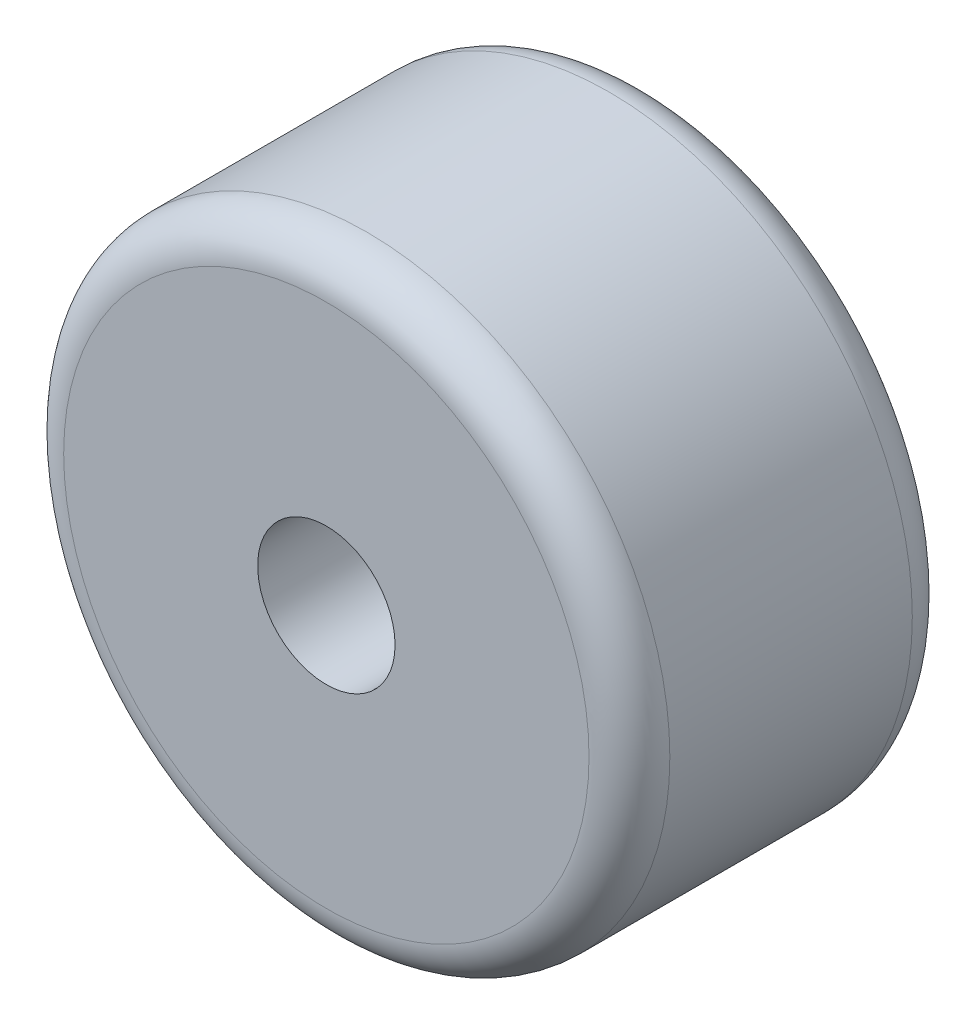
ISO-10303-21;
HEADER;
FILE_DESCRIPTION(('STEP AP214'),'2;1');
FILE_NAME('part.step','',(''),(''),'','','');
FILE_SCHEMA(('AUTOMOTIVE_DESIGN { 1 0 10303 214 1 1 1 1 }'));
ENDSEC;
DATA;
#1=APPLICATION_CONTEXT('core data for automotive mechanical design processes');
#2=APPLICATION_PROTOCOL_DEFINITION('international standard','automotive_design',2000,#1);
#3=PRODUCT_CONTEXT('',#1,'mechanical');
#4=PRODUCT('Part','Part','',(#3));
#5=PRODUCT_RELATED_PRODUCT_CATEGORY('part','',(#4));
#6=PRODUCT_DEFINITION_FORMATION('','',#4);
#7=PRODUCT_DEFINITION_CONTEXT('part definition',#1,'design');
#8=PRODUCT_DEFINITION('design','',#6,#7);
#9=PRODUCT_DEFINITION_SHAPE('','',#8);
#10=(LENGTH_UNIT() NAMED_UNIT(*) SI_UNIT(.MILLI.,.METRE.));
#11=(NAMED_UNIT(*) PLANE_ANGLE_UNIT() SI_UNIT($,.RADIAN.));
#12=(NAMED_UNIT(*) SI_UNIT($,.STERADIAN.) SOLID_ANGLE_UNIT());
#13=UNCERTAINTY_MEASURE_WITH_UNIT(LENGTH_MEASURE(1.E-05),#10,'distance_accuracy_value','');
#14=(GEOMETRIC_REPRESENTATION_CONTEXT(3) GLOBAL_UNCERTAINTY_ASSIGNED_CONTEXT((#13)) GLOBAL_UNIT_ASSIGNED_CONTEXT((#10,
#11,#12)) REPRESENTATION_CONTEXT('',''));
#15=CARTESIAN_POINT('',(0.,0.,0.));
#16=DIRECTION('',(0.,0.,1.));
#17=DIRECTION('',(1.,0.,0.));
#18=AXIS2_PLACEMENT_3D('',#15,#16,#17);
#19=CARTESIAN_POINT('',(0.,0.,8.));
#20=DIRECTION('',(0.,0.,1.));
#21=DIRECTION('',(1.,0.,0.));
#22=AXIS2_PLACEMENT_3D('',#19,#20,#21);
#23=PLANE('',#22);
#24=CARTESIAN_POINT('',(0.,0.,8.));
#25=DIRECTION('',(0.,0.,1.));
#26=DIRECTION('',(1.,0.,0.));
#27=AXIS2_PLACEMENT_3D('',#24,#25,#26);
#28=CIRCLE('',#27,6.5);
#29=CARTESIAN_POINT('',(6.5,0.,8.));
#30=VERTEX_POINT('',#29);
#31=EDGE_CURVE('E10',#30,#30,#28,.T.);
#32=ORIENTED_EDGE('',*,*,#31,.T.);
#33=EDGE_LOOP('',(#32));
#34=FACE_BOUND('',#33,.T.);
#35=CARTESIAN_POINT('',(0.,0.,8.));
#36=DIRECTION('',(0.,0.,1.));
#37=DIRECTION('',(1.,0.,0.));
#38=AXIS2_PLACEMENT_3D('',#35,#36,#37);
#39=CIRCLE('',#38,1.7);
#40=CARTESIAN_POINT('',(1.7,0.,8.));
#41=VERTEX_POINT('',#40);
#42=EDGE_CURVE('E55',#41,#41,#39,.T.);
#43=ORIENTED_EDGE('',*,*,#42,.F.);
#44=EDGE_LOOP('',(#43));
#45=FACE_BOUND('',#44,.T.);
#46=ADVANCED_FACE('F35',(#34,#45),#23,.T.);
#47=CARTESIAN_POINT('',(0.,0.,0.));
#48=DIRECTION('',(0.,0.,1.));
#49=DIRECTION('',(1.,0.,0.));
#50=AXIS2_PLACEMENT_3D('',#47,#48,#49);
#51=PLANE('',#50);
#52=CARTESIAN_POINT('',(0.,0.,0.));
#53=DIRECTION('',(0.,0.,1.));
#54=DIRECTION('',(1.,0.,0.));
#55=AXIS2_PLACEMENT_3D('',#52,#53,#54);
#56=CIRCLE('',#55,6.5);
#57=CARTESIAN_POINT('',(6.5,0.,0.));
#58=VERTEX_POINT('',#57);
#59=EDGE_CURVE('E42',#58,#58,#56,.F.);
#60=ORIENTED_EDGE('',*,*,#59,.T.);
#61=EDGE_LOOP('',(#60));
#62=FACE_BOUND('',#61,.T.);
#63=CARTESIAN_POINT('',(0.,0.,0.));
#64=DIRECTION('',(0.,0.,1.));
#65=DIRECTION('',(1.,0.,0.));
#66=AXIS2_PLACEMENT_3D('',#63,#64,#65);
#67=CIRCLE('',#66,1.7);
#68=CARTESIAN_POINT('',(1.7,0.,0.));
#69=VERTEX_POINT('',#68);
#70=EDGE_CURVE('E56',#69,#69,#67,.T.);
#71=ORIENTED_EDGE('',*,*,#70,.T.);
#72=EDGE_LOOP('',(#71));
#73=FACE_BOUND('',#72,.T.);
#74=ADVANCED_FACE('F66',(#62,#73),#51,.F.);
#75=CARTESIAN_POINT('',(0.,0.,8.));
#76=DIRECTION('',(0.,0.,-1.));
#77=DIRECTION('',(-1.,0.,0.));
#78=AXIS2_PLACEMENT_3D('',#75,#76,#77);
#79=CYLINDRICAL_SURFACE('',#78,7.5);
#80=CARTESIAN_POINT('',(0.,0.,1.));
#81=DIRECTION('',(0.,0.,1.));
#82=DIRECTION('',(1.,0.,0.));
#83=AXIS2_PLACEMENT_3D('',#80,#81,#82);
#84=CIRCLE('',#83,7.5);
#85=CARTESIAN_POINT('',(7.5,0.,1.));
#86=VERTEX_POINT('',#85);
#87=EDGE_CURVE('E46',#86,#86,#84,.T.);
#88=ORIENTED_EDGE('',*,*,#87,.T.);
#89=EDGE_LOOP('',(#88));
#90=FACE_BOUND('',#89,.T.);
#91=CARTESIAN_POINT('',(0.,0.,7.));
#92=DIRECTION('',(0.,0.,1.));
#93=DIRECTION('',(1.,0.,0.));
#94=AXIS2_PLACEMENT_3D('',#91,#92,#93);
#95=CIRCLE('',#94,7.5);
#96=CARTESIAN_POINT('',(7.5,0.,7.));
#97=VERTEX_POINT('',#96);
#98=EDGE_CURVE('E50',#97,#97,#95,.F.);
#99=ORIENTED_EDGE('',*,*,#98,.T.);
#100=EDGE_LOOP('',(#99));
#101=FACE_BOUND('',#100,.T.);
#102=ADVANCED_FACE('F71',(#90,#101),#79,.T.);
#103=CARTESIAN_POINT('',(0.,0.,8.));
#104=DIRECTION('',(0.,0.,-1.));
#105=DIRECTION('',(-1.,0.,0.));
#106=AXIS2_PLACEMENT_3D('',#103,#104,#105);
#107=CYLINDRICAL_SURFACE('',#106,1.7);
#108=ORIENTED_EDGE('',*,*,#42,.T.);
#109=EDGE_LOOP('',(#108));
#110=FACE_BOUND('',#109,.T.);
#111=ORIENTED_EDGE('',*,*,#70,.F.);
#112=EDGE_LOOP('',(#111));
#113=FACE_BOUND('',#112,.T.);
#114=ADVANCED_FACE('F62',(#110,#113),#107,.F.);
#115=CARTESIAN_POINT('',(0.,0.,1.));
#116=DIRECTION('',(0.,0.,1.));
#117=DIRECTION('',(1.,0.,0.));
#118=AXIS2_PLACEMENT_3D('',#115,#116,#117);
#119=TOROIDAL_SURFACE('',#118,6.5,1.);
#120=ORIENTED_EDGE('',*,*,#59,.F.);
#121=EDGE_LOOP('',(#120));
#122=FACE_BOUND('',#121,.T.);
#123=ORIENTED_EDGE('',*,*,#87,.F.);
#124=EDGE_LOOP('',(#123));
#125=FACE_BOUND('',#124,.T.);
#126=ADVANCED_FACE('F77',(#122,#125),#119,.T.);
#127=CARTESIAN_POINT('',(0.,0.,7.));
#128=DIRECTION('',(0.,0.,1.));
#129=DIRECTION('',(1.,0.,0.));
#130=AXIS2_PLACEMENT_3D('',#127,#128,#129);
#131=TOROIDAL_SURFACE('',#130,6.5,1.);
#132=ORIENTED_EDGE('',*,*,#98,.F.);
#133=EDGE_LOOP('',(#132));
#134=FACE_BOUND('',#133,.T.);
#135=ORIENTED_EDGE('',*,*,#31,.F.);
#136=EDGE_LOOP('',(#135));
#137=FACE_BOUND('',#136,.T.);
#138=ADVANCED_FACE('F37',(#134,#137),#131,.T.);
#139=CLOSED_SHELL('',(#46,#74,#102,#114,#126,#138));
#140=MANIFOLD_SOLID_BREP('B2',#139);
#141=ADVANCED_BREP_SHAPE_REPRESENTATION('',(#18,#140),#14);
#142=SHAPE_DEFINITION_REPRESENTATION(#9,#141);
ENDSEC;
END-ISO-10303-21;
